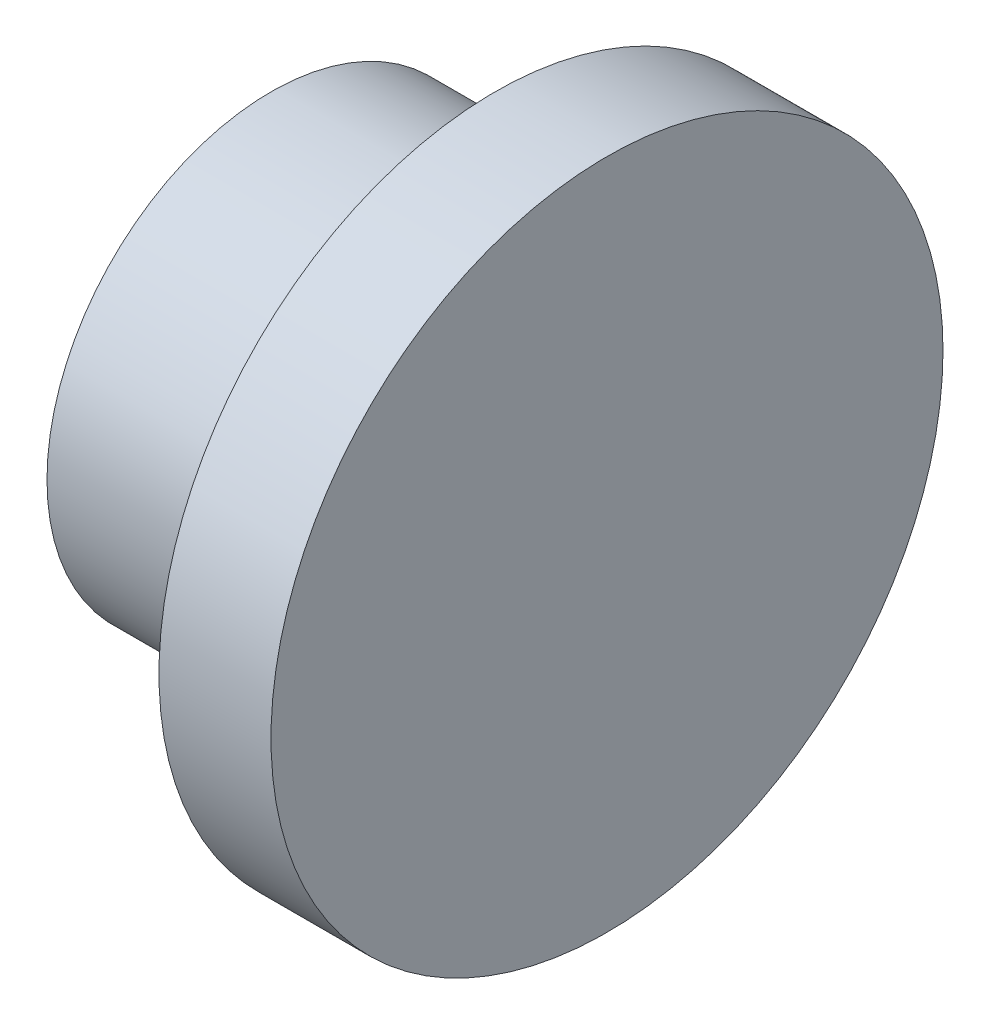
ISO-10303-21;
HEADER;
FILE_DESCRIPTION(('STEP AP214'),'2;1');
FILE_NAME('part.step','',(''),(''),'','','');
FILE_SCHEMA(('AUTOMOTIVE_DESIGN { 1 0 10303 214 1 1 1 1 }'));
ENDSEC;
DATA;
#1=APPLICATION_CONTEXT('core data for automotive mechanical design processes');
#2=APPLICATION_PROTOCOL_DEFINITION('international standard','automotive_design',2000,#1);
#3=PRODUCT_CONTEXT('',#1,'mechanical');
#4=PRODUCT('Part','Part','',(#3));
#5=PRODUCT_RELATED_PRODUCT_CATEGORY('part','',(#4));
#6=PRODUCT_DEFINITION_FORMATION('','',#4);
#7=PRODUCT_DEFINITION_CONTEXT('part definition',#1,'design');
#8=PRODUCT_DEFINITION('design','',#6,#7);
#9=PRODUCT_DEFINITION_SHAPE('','',#8);
#10=(LENGTH_UNIT() NAMED_UNIT(*) SI_UNIT(.MILLI.,.METRE.));
#11=(NAMED_UNIT(*) PLANE_ANGLE_UNIT() SI_UNIT($,.RADIAN.));
#12=(NAMED_UNIT(*) SI_UNIT($,.STERADIAN.) SOLID_ANGLE_UNIT());
#13=UNCERTAINTY_MEASURE_WITH_UNIT(LENGTH_MEASURE(1.E-05),#10,'distance_accuracy_value','');
#14=(GEOMETRIC_REPRESENTATION_CONTEXT(3) GLOBAL_UNCERTAINTY_ASSIGNED_CONTEXT((#13)) GLOBAL_UNIT_ASSIGNED_CONTEXT((#10,
#11,#12)) REPRESENTATION_CONTEXT('',''));
#15=CARTESIAN_POINT('',(0.,0.,0.));
#16=DIRECTION('',(0.,0.,1.));
#17=DIRECTION('',(1.,0.,0.));
#18=AXIS2_PLACEMENT_3D('',#15,#16,#17);
#19=CARTESIAN_POINT('',(5.,0.,0.));
#20=DIRECTION('',(-1.,0.,0.));
#21=DIRECTION('',(0.,0.,1.));
#22=AXIS2_PLACEMENT_3D('',#19,#20,#21);
#23=CYLINDRICAL_SURFACE('',#22,15.);
#24=CARTESIAN_POINT('',(5.,0.,0.));
#25=DIRECTION('',(1.,0.,0.));
#26=DIRECTION('',(0.,0.,-1.));
#27=AXIS2_PLACEMENT_3D('',#24,#25,#26);
#28=CIRCLE('',#27,15.);
#29=CARTESIAN_POINT('',(5.,0.,-15.));
#30=VERTEX_POINT('',#29);
#31=EDGE_CURVE('E38',#30,#30,#28,.T.);
#32=ORIENTED_EDGE('',*,*,#31,.F.);
#33=EDGE_LOOP('',(#32));
#34=FACE_BOUND('',#33,.T.);
#35=CARTESIAN_POINT('',(0.,0.,0.));
#36=DIRECTION('',(1.,0.,0.));
#37=DIRECTION('',(0.,0.,-1.));
#38=AXIS2_PLACEMENT_3D('',#35,#36,#37);
#39=CIRCLE('',#38,15.);
#40=CARTESIAN_POINT('',(0.,0.,-15.));
#41=VERTEX_POINT('',#40);
#42=EDGE_CURVE('E34',#41,#41,#39,.T.);
#43=ORIENTED_EDGE('',*,*,#42,.T.);
#44=EDGE_LOOP('',(#43));
#45=FACE_BOUND('',#44,.T.);
#46=ADVANCED_FACE('F31',(#34,#45),#23,.T.);
#47=CARTESIAN_POINT('',(5.,0.,0.));
#48=DIRECTION('',(1.,0.,0.));
#49=DIRECTION('',(0.,0.,-1.));
#50=AXIS2_PLACEMENT_3D('',#47,#48,#49);
#51=PLANE('',#50);
#52=ORIENTED_EDGE('',*,*,#31,.T.);
#53=EDGE_LOOP('',(#52));
#54=FACE_BOUND('',#53,.T.);
#55=ADVANCED_FACE('F75',(#54),#51,.T.);
#56=CARTESIAN_POINT('',(0.,0.,0.));
#57=DIRECTION('',(1.,0.,0.));
#58=DIRECTION('',(0.,0.,-1.));
#59=AXIS2_PLACEMENT_3D('',#56,#57,#58);
#60=PLANE('',#59);
#61=CARTESIAN_POINT('',(0.,0.,0.));
#62=DIRECTION('',(-1.,0.,0.));
#63=DIRECTION('',(0.,0.,1.));
#64=AXIS2_PLACEMENT_3D('',#61,#62,#63);
#65=CIRCLE('',#64,10.);
#66=CARTESIAN_POINT('',(0.,0.,10.));
#67=VERTEX_POINT('',#66);
#68=EDGE_CURVE('E10',#67,#67,#65,.T.);
#69=ORIENTED_EDGE('',*,*,#68,.F.);
#70=EDGE_LOOP('',(#69));
#71=FACE_BOUND('',#70,.T.);
#72=ORIENTED_EDGE('',*,*,#42,.F.);
#73=EDGE_LOOP('',(#72));
#74=FACE_BOUND('',#73,.T.);
#75=ADVANCED_FACE('F70',(#71,#74),#60,.F.);
#76=CARTESIAN_POINT('',(-10.,0.,0.));
#77=DIRECTION('',(1.,0.,0.));
#78=DIRECTION('',(0.,0.,-1.));
#79=AXIS2_PLACEMENT_3D('',#76,#77,#78);
#80=CYLINDRICAL_SURFACE('',#79,10.);
#81=CARTESIAN_POINT('',(-10.,0.,0.));
#82=DIRECTION('',(-1.,0.,0.));
#83=DIRECTION('',(0.,0.,1.));
#84=AXIS2_PLACEMENT_3D('',#81,#82,#83);
#85=CIRCLE('',#84,10.);
#86=CARTESIAN_POINT('',(-10.,0.,10.));
#87=VERTEX_POINT('',#86);
#88=EDGE_CURVE('E44',#87,#87,#85,.T.);
#89=ORIENTED_EDGE('',*,*,#88,.F.);
#90=EDGE_LOOP('',(#89));
#91=FACE_BOUND('',#90,.T.);
#92=ORIENTED_EDGE('',*,*,#68,.T.);
#93=EDGE_LOOP('',(#92));
#94=FACE_BOUND('',#93,.T.);
#95=ADVANCED_FACE('F65',(#91,#94),#80,.T.);
#96=CARTESIAN_POINT('',(-10.,0.,0.));
#97=DIRECTION('',(-1.,0.,0.));
#98=DIRECTION('',(0.,0.,1.));
#99=AXIS2_PLACEMENT_3D('',#96,#97,#98);
#100=PLANE('',#99);
#101=CARTESIAN_POINT('',(-10.,0.,0.));
#102=DIRECTION('',(-1.,0.,0.));
#103=DIRECTION('',(0.,0.,1.));
#104=AXIS2_PLACEMENT_3D('',#101,#102,#103);
#105=CIRCLE('',#104,5.);
#106=CARTESIAN_POINT('',(-10.,0.,5.));
#107=VERTEX_POINT('',#106);
#108=EDGE_CURVE('E48',#107,#107,#105,.T.);
#109=ORIENTED_EDGE('',*,*,#108,.F.);
#110=EDGE_LOOP('',(#109));
#111=FACE_BOUND('',#110,.T.);
#112=ORIENTED_EDGE('',*,*,#88,.T.);
#113=EDGE_LOOP('',(#112));
#114=FACE_BOUND('',#113,.T.);
#115=ADVANCED_FACE('F59',(#111,#114),#100,.T.);
#116=CARTESIAN_POINT('',(0.,0.,0.));
#117=DIRECTION('',(-1.,0.,0.));
#118=DIRECTION('',(0.,0.,1.));
#119=AXIS2_PLACEMENT_3D('',#116,#117,#118);
#120=CYLINDRICAL_SURFACE('',#119,5.);
#121=CARTESIAN_POINT('',(0.,0.,0.));
#122=DIRECTION('',(-1.,0.,0.));
#123=DIRECTION('',(0.,0.,1.));
#124=AXIS2_PLACEMENT_3D('',#121,#122,#123);
#125=CIRCLE('',#124,5.);
#126=CARTESIAN_POINT('',(0.,0.,5.));
#127=VERTEX_POINT('',#126);
#128=EDGE_CURVE('E47',#127,#127,#125,.T.);
#129=ORIENTED_EDGE('',*,*,#128,.F.);
#130=EDGE_LOOP('',(#129));
#131=FACE_BOUND('',#130,.T.);
#132=ORIENTED_EDGE('',*,*,#108,.T.);
#133=EDGE_LOOP('',(#132));
#134=FACE_BOUND('',#133,.T.);
#135=ADVANCED_FACE('F56',(#131,#134),#120,.F.);
#136=CARTESIAN_POINT('',(0.,0.,0.));
#137=DIRECTION('',(-1.,0.,0.));
#138=DIRECTION('',(0.,0.,1.));
#139=AXIS2_PLACEMENT_3D('',#136,#137,#138);
#140=PLANE('',#139);
#141=ORIENTED_EDGE('',*,*,#128,.T.);
#142=EDGE_LOOP('',(#141));
#143=FACE_BOUND('',#142,.T.);
#144=ADVANCED_FACE('F54',(#143),#140,.T.);
#145=CLOSED_SHELL('',(#46,#55,#75,#95,#115,#135,#144));
#146=MANIFOLD_SOLID_BREP('B2',#145);
#147=ADVANCED_BREP_SHAPE_REPRESENTATION('',(#18,#146),#14);
#148=SHAPE_DEFINITION_REPRESENTATION(#9,#147);
ENDSEC;
END-ISO-10303-21;
